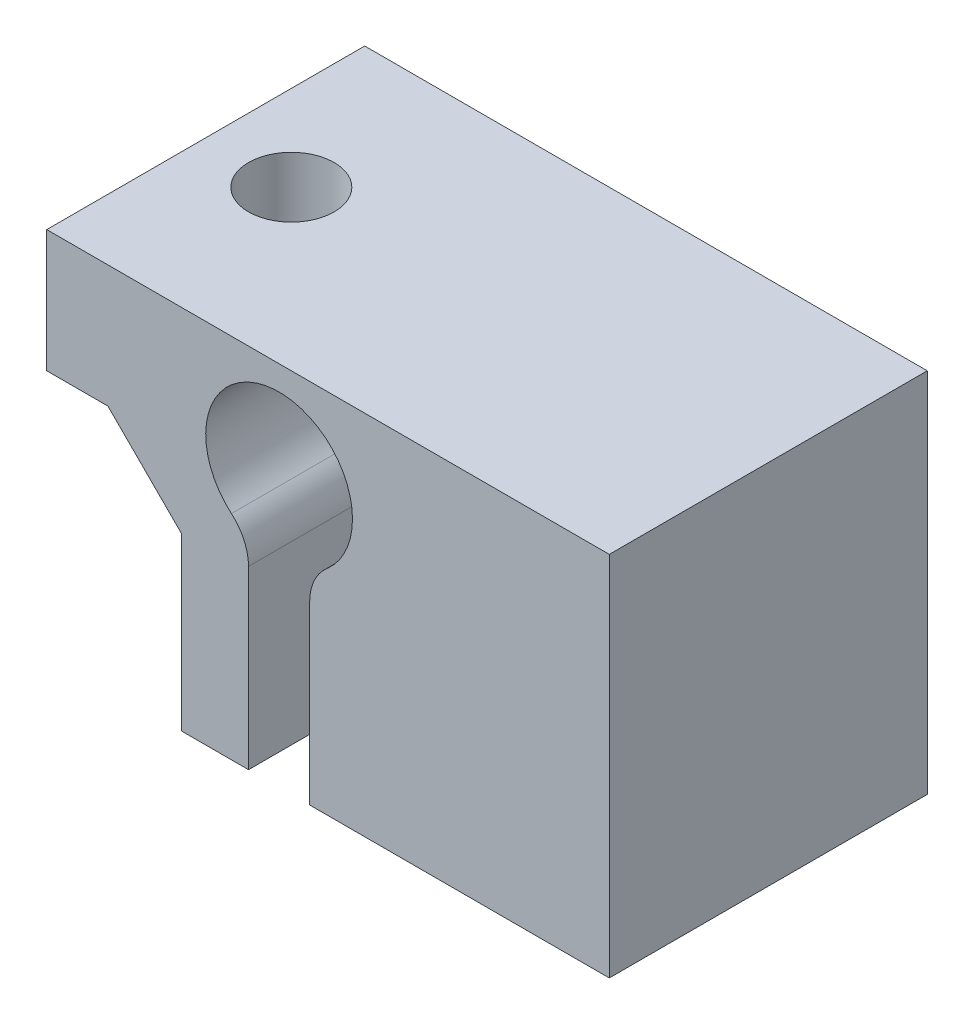
ISO-10303-21;
HEADER;
FILE_DESCRIPTION(('STEP AP214'),'2;1');
FILE_NAME('part.step','',(''),(''),'','','');
FILE_SCHEMA(('AUTOMOTIVE_DESIGN { 1 0 10303 214 1 1 1 1 }'));
ENDSEC;
DATA;
#1=APPLICATION_CONTEXT('core data for automotive mechanical design processes');
#2=APPLICATION_PROTOCOL_DEFINITION('international standard','automotive_design',2000,#1);
#3=PRODUCT_CONTEXT('',#1,'mechanical');
#4=PRODUCT('Part','Part','',(#3));
#5=PRODUCT_RELATED_PRODUCT_CATEGORY('part','',(#4));
#6=PRODUCT_DEFINITION_FORMATION('','',#4);
#7=PRODUCT_DEFINITION_CONTEXT('part definition',#1,'design');
#8=PRODUCT_DEFINITION('design','',#6,#7);
#9=PRODUCT_DEFINITION_SHAPE('','',#8);
#10=(LENGTH_UNIT() NAMED_UNIT(*) SI_UNIT(.MILLI.,.METRE.));
#11=(NAMED_UNIT(*) PLANE_ANGLE_UNIT() SI_UNIT($,.RADIAN.));
#12=(NAMED_UNIT(*) SI_UNIT($,.STERADIAN.) SOLID_ANGLE_UNIT());
#13=UNCERTAINTY_MEASURE_WITH_UNIT(LENGTH_MEASURE(1.E-05),#10,'distance_accuracy_value','');
#14=(GEOMETRIC_REPRESENTATION_CONTEXT(3) GLOBAL_UNCERTAINTY_ASSIGNED_CONTEXT((#13)) GLOBAL_UNIT_ASSIGNED_CONTEXT((#10,
#11,#12)) REPRESENTATION_CONTEXT('',''));
#15=CARTESIAN_POINT('',(0.,0.,0.));
#16=DIRECTION('',(0.,0.,1.));
#17=DIRECTION('',(1.,0.,0.));
#18=AXIS2_PLACEMENT_3D('',#15,#16,#17);
#19=CARTESIAN_POINT('',(0.,11.,-6.5));
#20=DIRECTION('',(0.,0.,1.));
#21=DIRECTION('',(1.,0.,0.));
#22=AXIS2_PLACEMENT_3D('',#19,#20,#21);
#23=CYLINDRICAL_SURFACE('',#22,1.75);
#24=CARTESIAN_POINT('',(0.,11.,-2.5));
#25=DIRECTION('',(0.,0.,1.));
#26=DIRECTION('',(1.,0.,0.));
#27=AXIS2_PLACEMENT_3D('',#24,#25,#26);
#28=CIRCLE('',#27,1.75);
#29=CARTESIAN_POINT('',(1.75,11.,-2.5));
#30=VERTEX_POINT('',#29);
#31=EDGE_CURVE('E258',#30,#30,#28,.T.);
#32=ORIENTED_EDGE('',*,*,#31,.T.);
#33=EDGE_LOOP('',(#32));
#34=FACE_BOUND('',#33,.T.);
#35=CARTESIAN_POINT('',(0.,11.,-4.));
#36=DIRECTION('',(0.,0.,-1.));
#37=DIRECTION('',(-1.,0.,0.));
#38=AXIS2_PLACEMENT_3D('',#35,#36,#37);
#39=CIRCLE('',#38,1.75);
#40=CARTESIAN_POINT('',(-1.75,11.,-4.));
#41=VERTEX_POINT('',#40);
#42=EDGE_CURVE('E226',#41,#41,#39,.T.);
#43=ORIENTED_EDGE('',*,*,#42,.T.);
#44=EDGE_LOOP('',(#43));
#45=FACE_BOUND('',#44,.T.);
#46=ADVANCED_FACE('F39',(#34,#45),#23,.F.);
#47=CARTESIAN_POINT('',(-13.5,16.,6.5));
#48=DIRECTION('',(0.,0.,-1.));
#49=DIRECTION('',(-1.,0.,0.));
#50=AXIS2_PLACEMENT_3D('',#47,#48,#49);
#51=PLANE('',#50);
#52=DIRECTION('',(0.,-1.,0.));
#53=VECTOR('',#52,1.);
#54=CARTESIAN_POINT('',(-1.25,0.,6.5));
#55=LINE('',#54,#53);
#56=CARTESIAN_POINT('',(-1.25,7.20032896160733,6.5));
#57=VERTEX_POINT('',#56);
#58=CARTESIAN_POINT('',(-1.25,0.,6.5));
#59=VERTEX_POINT('',#58);
#60=EDGE_CURVE('E322',#57,#59,#55,.T.);
#61=ORIENTED_EDGE('',*,*,#60,.F.);
#62=CARTESIAN_POINT('',(-3.25,7.20032896160733,6.5));
#63=DIRECTION('',(0.,0.,-1.));
#64=DIRECTION('',(-1.,0.,0.));
#65=AXIS2_PLACEMENT_3D('',#62,#63,#64);
#66=CIRCLE('',#65,2.);
#67=CARTESIAN_POINT('',(-1.95,8.7201973769644,6.5));
#68=VERTEX_POINT('',#67);
#69=EDGE_CURVE('E420',#57,#68,#66,.F.);
#70=ORIENTED_EDGE('',*,*,#69,.T.);
#71=CARTESIAN_POINT('',(0.,11.,6.5));
#72=DIRECTION('',(0.,0.,1.));
#73=DIRECTION('',(1.,0.,0.));
#74=AXIS2_PLACEMENT_3D('',#71,#72,#73);
#75=CIRCLE('',#74,3.);
#76=CARTESIAN_POINT('',(1.95,8.7201973769644,6.5));
#77=VERTEX_POINT('',#76);
#78=EDGE_CURVE('E304',#77,#68,#75,.T.);
#79=ORIENTED_EDGE('',*,*,#78,.F.);
#80=CARTESIAN_POINT('',(3.25,7.20032896160733,6.5));
#81=DIRECTION('',(0.,0.,-1.));
#82=DIRECTION('',(-1.,0.,0.));
#83=AXIS2_PLACEMENT_3D('',#80,#81,#82);
#84=CIRCLE('',#83,2.);
#85=CARTESIAN_POINT('',(1.25,7.20032896160733,6.5));
#86=VERTEX_POINT('',#85);
#87=EDGE_CURVE('E417',#77,#86,#84,.F.);
#88=ORIENTED_EDGE('',*,*,#87,.T.);
#89=DIRECTION('',(0.,-1.,0.));
#90=VECTOR('',#89,1.);
#91=CARTESIAN_POINT('',(1.25,0.,6.5));
#92=LINE('',#91,#90);
#93=CARTESIAN_POINT('',(1.25,0.,6.5));
#94=VERTEX_POINT('',#93);
#95=EDGE_CURVE('E309',#86,#94,#92,.T.);
#96=ORIENTED_EDGE('',*,*,#95,.T.);
#97=DIRECTION('',(1.,0.,0.));
#98=VECTOR('',#97,1.);
#99=CARTESIAN_POINT('',(-13.5,0.,6.5));
#100=LINE('',#99,#98);
#101=CARTESIAN_POINT('',(13.5,0.,6.5));
#102=VERTEX_POINT('',#101);
#103=EDGE_CURVE('E361',#94,#102,#100,.T.);
#104=ORIENTED_EDGE('',*,*,#103,.T.);
#105=DIRECTION('',(0.,-1.,0.));
#106=VECTOR('',#105,1.);
#107=CARTESIAN_POINT('',(13.5,16.,6.5));
#108=LINE('',#107,#106);
#109=CARTESIAN_POINT('',(13.5,15.,6.5));
#110=VERTEX_POINT('',#109);
#111=EDGE_CURVE('E366',#110,#102,#108,.T.);
#112=ORIENTED_EDGE('',*,*,#111,.F.);
#113=DIRECTION('',(1.,0.,0.));
#114=VECTOR('',#113,1.);
#115=CARTESIAN_POINT('',(-9.49999999999999,15.,6.5));
#116=LINE('',#115,#114);
#117=CARTESIAN_POINT('',(-9.49999999999999,15.,6.5));
#118=VERTEX_POINT('',#117);
#119=EDGE_CURVE('E276',#118,#110,#116,.T.);
#120=ORIENTED_EDGE('',*,*,#119,.F.);
#121=DIRECTION('',(0.,1.,0.));
#122=VECTOR('',#121,1.);
#123=CARTESIAN_POINT('',(-9.49999999999999,10.,6.5));
#124=LINE('',#123,#122);
#125=CARTESIAN_POINT('',(-9.49999999999999,10.,6.5));
#126=VERTEX_POINT('',#125);
#127=EDGE_CURVE('E300',#126,#118,#124,.T.);
#128=ORIENTED_EDGE('',*,*,#127,.F.);
#129=DIRECTION('',(1.,0.,0.));
#130=VECTOR('',#129,1.);
#131=CARTESIAN_POINT('',(-13.5,10.,6.5));
#132=LINE('',#131,#130);
#133=CARTESIAN_POINT('',(-6.99999999999998,10.,6.5));
#134=VERTEX_POINT('',#133);
#135=EDGE_CURVE('E335',#126,#134,#132,.T.);
#136=ORIENTED_EDGE('',*,*,#135,.T.);
#137=DIRECTION('',(0.707106781186544,-0.707106781186551,0.));
#138=VECTOR('',#137,1.);
#139=CARTESIAN_POINT('',(-13.25,16.25,6.5));
#140=LINE('',#139,#138);
#141=CARTESIAN_POINT('',(-3.99999999999999,6.99999999999998,6.5));
#142=VERTEX_POINT('',#141);
#143=EDGE_CURVE('E410',#134,#142,#140,.T.);
#144=ORIENTED_EDGE('',*,*,#143,.T.);
#145=DIRECTION('',(0.,-1.,0.));
#146=VECTOR('',#145,1.);
#147=CARTESIAN_POINT('',(-3.99999999999999,10.,6.5));
#148=LINE('',#147,#146);
#149=CARTESIAN_POINT('',(-3.99999999999999,0.,6.5));
#150=VERTEX_POINT('',#149);
#151=EDGE_CURVE('E350',#142,#150,#148,.T.);
#152=ORIENTED_EDGE('',*,*,#151,.T.);
#153=EDGE_CURVE('E362',#150,#59,#100,.T.);
#154=ORIENTED_EDGE('',*,*,#153,.T.);
#155=EDGE_LOOP('',(#61,#70,#79,#88,#96,#104,#112,#120,#128,#136,#144,#152,#154));
#156=FACE_BOUND('',#155,.T.);
#157=ADVANCED_FACE('F445',(#156),#51,.F.);
#158=CARTESIAN_POINT('',(-13.5,16.,-6.5));
#159=DIRECTION('',(0.,0.,1.));
#160=DIRECTION('',(1.,0.,0.));
#161=AXIS2_PLACEMENT_3D('',#158,#159,#160);
#162=PLANE('',#161);
#163=DIRECTION('',(0.866025403784438,-0.5,0.));
#164=VECTOR('',#163,1.);
#165=CARTESIAN_POINT('',(0.,14.1754264805429,-6.5));
#166=LINE('',#165,#164);
#167=CARTESIAN_POINT('',(0.,14.1754264805429,-6.5));
#168=VERTEX_POINT('',#167);
#169=CARTESIAN_POINT('',(2.75,12.5877132402715,-6.5));
#170=VERTEX_POINT('',#169);
#171=EDGE_CURVE('E241',#168,#170,#166,.T.);
#172=ORIENTED_EDGE('',*,*,#171,.F.);
#173=DIRECTION('',(0.866025403784439,0.5,0.));
#174=VECTOR('',#173,1.);
#175=CARTESIAN_POINT('',(-2.75,12.5877132402715,-6.5));
#176=LINE('',#175,#174);
#177=CARTESIAN_POINT('',(-2.75,12.5877132402715,-6.5));
#178=VERTEX_POINT('',#177);
#179=EDGE_CURVE('E198',#178,#168,#176,.T.);
#180=ORIENTED_EDGE('',*,*,#179,.F.);
#181=DIRECTION('',(0.,1.,0.));
#182=VECTOR('',#181,1.);
#183=CARTESIAN_POINT('',(-2.75,9.41228675972853,-6.5));
#184=LINE('',#183,#182);
#185=CARTESIAN_POINT('',(-2.75,9.41228675972853,-6.5));
#186=VERTEX_POINT('',#185);
#187=EDGE_CURVE('E219',#186,#178,#184,.T.);
#188=ORIENTED_EDGE('',*,*,#187,.F.);
#189=DIRECTION('',(-0.866025403784439,0.5,0.));
#190=VECTOR('',#189,1.);
#191=CARTESIAN_POINT('',(0.,7.82457351945706,-6.5));
#192=LINE('',#191,#190);
#193=CARTESIAN_POINT('',(0.,7.82457351945706,-6.5));
#194=VERTEX_POINT('',#193);
#195=EDGE_CURVE('E223',#194,#186,#192,.T.);
#196=ORIENTED_EDGE('',*,*,#195,.F.);
#197=DIRECTION('',(-0.866025403784439,-0.5,0.));
#198=VECTOR('',#197,1.);
#199=CARTESIAN_POINT('',(2.75,9.41228675972853,-6.5));
#200=LINE('',#199,#198);
#201=CARTESIAN_POINT('',(2.75,9.41228675972853,-6.5));
#202=VERTEX_POINT('',#201);
#203=EDGE_CURVE('E248',#202,#194,#200,.T.);
#204=ORIENTED_EDGE('',*,*,#203,.F.);
#205=DIRECTION('',(0.,-1.,0.));
#206=VECTOR('',#205,1.);
#207=CARTESIAN_POINT('',(2.75,12.5877132402715,-6.5));
#208=LINE('',#207,#206);
#209=EDGE_CURVE('E244',#170,#202,#208,.T.);
#210=ORIENTED_EDGE('',*,*,#209,.F.);
#211=EDGE_LOOP('',(#172,#180,#188,#196,#204,#210));
#212=FACE_BOUND('',#211,.T.);
#213=DIRECTION('',(-1.,0.,0.));
#214=VECTOR('',#213,1.);
#215=CARTESIAN_POINT('',(13.5,15.,-6.5));
#216=LINE('',#215,#214);
#217=CARTESIAN_POINT('',(13.5,15.,-6.5));
#218=VERTEX_POINT('',#217);
#219=CARTESIAN_POINT('',(-9.49999999999999,15.,-6.5));
#220=VERTEX_POINT('',#219);
#221=EDGE_CURVE('E270',#218,#220,#216,.T.);
#222=ORIENTED_EDGE('',*,*,#221,.F.);
#223=DIRECTION('',(0.,-1.,0.));
#224=VECTOR('',#223,1.);
#225=CARTESIAN_POINT('',(13.5,16.,-6.5));
#226=LINE('',#225,#224);
#227=CARTESIAN_POINT('',(13.5,0.,-6.5));
#228=VERTEX_POINT('',#227);
#229=EDGE_CURVE('E369',#218,#228,#226,.T.);
#230=ORIENTED_EDGE('',*,*,#229,.T.);
#231=DIRECTION('',(-1.,0.,0.));
#232=VECTOR('',#231,1.);
#233=CARTESIAN_POINT('',(-13.5,0.,-6.5));
#234=LINE('',#233,#232);
#235=CARTESIAN_POINT('',(-3.99999999999999,0.,-6.5));
#236=VERTEX_POINT('',#235);
#237=EDGE_CURVE('E357',#228,#236,#234,.T.);
#238=ORIENTED_EDGE('',*,*,#237,.T.);
#239=DIRECTION('',(0.,-1.,0.));
#240=VECTOR('',#239,1.);
#241=CARTESIAN_POINT('',(-3.99999999999999,10.,-6.5));
#242=LINE('',#241,#240);
#243=CARTESIAN_POINT('',(-3.99999999999999,6.99999999999998,-6.5));
#244=VERTEX_POINT('',#243);
#245=EDGE_CURVE('E343',#244,#236,#242,.T.);
#246=ORIENTED_EDGE('',*,*,#245,.F.);
#247=DIRECTION('',(-0.707106781186544,0.707106781186551,0.));
#248=VECTOR('',#247,1.);
#249=CARTESIAN_POINT('',(-13.25,16.25,-6.5));
#250=LINE('',#249,#248);
#251=CARTESIAN_POINT('',(-6.99999999999998,10.,-6.5));
#252=VERTEX_POINT('',#251);
#253=EDGE_CURVE('E400',#244,#252,#250,.T.);
#254=ORIENTED_EDGE('',*,*,#253,.T.);
#255=DIRECTION('',(-1.,0.,0.));
#256=VECTOR('',#255,1.);
#257=CARTESIAN_POINT('',(-13.5,10.,-6.5));
#258=LINE('',#257,#256);
#259=CARTESIAN_POINT('',(-9.49999999999999,10.,-6.5));
#260=VERTEX_POINT('',#259);
#261=EDGE_CURVE('E339',#252,#260,#258,.T.);
#262=ORIENTED_EDGE('',*,*,#261,.T.);
#263=DIRECTION('',(0.,-1.,0.));
#264=VECTOR('',#263,1.);
#265=CARTESIAN_POINT('',(-9.49999999999999,16.,-6.5));
#266=LINE('',#265,#264);
#267=EDGE_CURVE('E291',#220,#260,#266,.T.);
#268=ORIENTED_EDGE('',*,*,#267,.F.);
#269=EDGE_LOOP('',(#222,#230,#238,#246,#254,#262,#268));
#270=FACE_BOUND('',#269,.T.);
#271=ADVANCED_FACE('F468',(#212,#270),#162,.F.);
#272=CARTESIAN_POINT('',(13.5,16.,6.5));
#273=DIRECTION('',(-1.,0.,0.));
#274=DIRECTION('',(0.,0.,1.));
#275=AXIS2_PLACEMENT_3D('',#272,#273,#274);
#276=PLANE('',#275);
#277=DIRECTION('',(0.,0.,-1.));
#278=VECTOR('',#277,1.);
#279=CARTESIAN_POINT('',(13.5,15.,6.5));
#280=LINE('',#279,#278);
#281=EDGE_CURVE('E279',#110,#218,#280,.T.);
#282=ORIENTED_EDGE('',*,*,#281,.F.);
#283=ORIENTED_EDGE('',*,*,#111,.T.);
#284=DIRECTION('',(0.,0.,-1.));
#285=VECTOR('',#284,1.);
#286=CARTESIAN_POINT('',(13.5,0.,6.5));
#287=LINE('',#286,#285);
#288=EDGE_CURVE('E353',#102,#228,#287,.T.);
#289=ORIENTED_EDGE('',*,*,#288,.T.);
#290=ORIENTED_EDGE('',*,*,#229,.F.);
#291=EDGE_LOOP('',(#282,#283,#289,#290));
#292=FACE_BOUND('',#291,.T.);
#293=ADVANCED_FACE('F473',(#292),#276,.F.);
#294=CARTESIAN_POINT('',(-5.99999999999999,16.,0.));
#295=DIRECTION('',(0.,-1.,0.));
#296=DIRECTION('',(0.,0.,-1.));
#297=AXIS2_PLACEMENT_3D('',#294,#295,#296);
#298=CYLINDRICAL_SURFACE('',#297,1.75);
#299=CARTESIAN_POINT('',(-5.99999999999999,10.,0.));
#300=DIRECTION('',(0.,1.,0.));
#301=DIRECTION('',(0.,0.,1.));
#302=AXIS2_PLACEMENT_3D('',#299,#300,#301);
#303=CIRCLE('',#302,1.75);
#304=CARTESIAN_POINT('',(-5.99999999999999,10.,1.75));
#305=VERTEX_POINT('',#304);
#306=EDGE_CURVE('E331',#305,#305,#303,.F.);
#307=ORIENTED_EDGE('',*,*,#306,.T.);
#308=EDGE_LOOP('',(#307));
#309=FACE_BOUND('',#308,.T.);
#310=CARTESIAN_POINT('',(-5.99999999999999,15.,0.));
#311=DIRECTION('',(0.,1.,0.));
#312=DIRECTION('',(0.,0.,1.));
#313=AXIS2_PLACEMENT_3D('',#310,#311,#312);
#314=CIRCLE('',#313,1.75);
#315=CARTESIAN_POINT('',(-5.99999999999999,15.,1.75));
#316=VERTEX_POINT('',#315);
#317=EDGE_CURVE('E282',#316,#316,#314,.T.);
#318=ORIENTED_EDGE('',*,*,#317,.T.);
#319=EDGE_LOOP('',(#318));
#320=FACE_BOUND('',#319,.T.);
#321=ADVANCED_FACE('F533',(#309,#320),#298,.F.);
#322=CARTESIAN_POINT('',(-9.49999999999999,0.,0.));
#323=DIRECTION('',(-1.,0.,0.));
#324=DIRECTION('',(0.,0.,1.));
#325=AXIS2_PLACEMENT_3D('',#322,#323,#324);
#326=PLANE('',#325);
#327=ORIENTED_EDGE('',*,*,#127,.T.);
#328=DIRECTION('',(0.,0.,1.));
#329=VECTOR('',#328,1.);
#330=CARTESIAN_POINT('',(-9.49999999999999,15.,-6.5));
#331=LINE('',#330,#329);
#332=EDGE_CURVE('E273',#220,#118,#331,.T.);
#333=ORIENTED_EDGE('',*,*,#332,.F.);
#334=ORIENTED_EDGE('',*,*,#267,.T.);
#335=DIRECTION('',(0.,0.,1.));
#336=VECTOR('',#335,1.);
#337=CARTESIAN_POINT('',(-9.49999999999999,10.,-6.5));
#338=LINE('',#337,#336);
#339=EDGE_CURVE('E297',#260,#126,#338,.T.);
#340=ORIENTED_EDGE('',*,*,#339,.T.);
#341=EDGE_LOOP('',(#327,#333,#334,#340));
#342=FACE_BOUND('',#341,.T.);
#343=ADVANCED_FACE('F480',(#342),#326,.T.);
#344=CARTESIAN_POINT('',(-3.99999999999999,10.,-6.5));
#345=DIRECTION('',(-1.,0.,0.));
#346=DIRECTION('',(0.,0.,1.));
#347=AXIS2_PLACEMENT_3D('',#344,#345,#346);
#348=PLANE('',#347);
#349=ORIENTED_EDGE('',*,*,#151,.F.);
#350=DIRECTION('',(0.,0.,-1.));
#351=VECTOR('',#350,1.);
#352=CARTESIAN_POINT('',(-3.99999999999999,6.99999999999998,-6.5));
#353=LINE('',#352,#351);
#354=CARTESIAN_POINT('',(-3.99999999999999,6.99999999999998,2.23606797749979));
#355=VERTEX_POINT('',#354);
#356=EDGE_CURVE('E396',#142,#355,#353,.T.);
#357=ORIENTED_EDGE('',*,*,#356,.T.);
#358=DIRECTION('',(0.,1.,0.));
#359=VECTOR('',#358,1.);
#360=CARTESIAN_POINT('',(-3.99999999999999,0.,2.23606797749979));
#361=LINE('',#360,#359);
#362=CARTESIAN_POINT('',(-3.99999999999999,0.,2.23606797749979));
#363=VERTEX_POINT('',#362);
#364=EDGE_CURVE('E379',#355,#363,#361,.F.);
#365=ORIENTED_EDGE('',*,*,#364,.T.);
#366=DIRECTION('',(0.,0.,-1.));
#367=VECTOR('',#366,1.);
#368=CARTESIAN_POINT('',(-3.99999999999999,0.,-6.5));
#369=LINE('',#368,#367);
#370=EDGE_CURVE('E340',#150,#363,#369,.T.);
#371=ORIENTED_EDGE('',*,*,#370,.F.);
#372=EDGE_LOOP('',(#349,#357,#365,#371));
#373=FACE_BOUND('',#372,.T.);
#374=ADVANCED_FACE('F494',(#373),#348,.T.);
#375=DIRECTION('',(0.,1.,0.));
#376=VECTOR('',#375,1.);
#377=CARTESIAN_POINT('',(-3.99999999999999,0.,-2.23606797749979));
#378=LINE('',#377,#376);
#379=CARTESIAN_POINT('',(-3.99999999999999,0.,-2.23606797749979));
#380=VERTEX_POINT('',#379);
#381=CARTESIAN_POINT('',(-3.99999999999999,6.99999999999998,-2.23606797749979));
#382=VERTEX_POINT('',#381);
#383=EDGE_CURVE('E372',#380,#382,#378,.T.);
#384=ORIENTED_EDGE('',*,*,#383,.T.);
#385=DIRECTION('',(0.,0.,-1.));
#386=VECTOR('',#385,1.);
#387=CARTESIAN_POINT('',(-3.99999999999999,6.99999999999998,-6.5));
#388=LINE('',#387,#386);
#389=EDGE_CURVE('E382',#382,#244,#388,.T.);
#390=ORIENTED_EDGE('',*,*,#389,.T.);
#391=ORIENTED_EDGE('',*,*,#245,.T.);
#392=EDGE_CURVE('E347',#380,#236,#369,.T.);
#393=ORIENTED_EDGE('',*,*,#392,.F.);
#394=EDGE_LOOP('',(#384,#390,#391,#393));
#395=FACE_BOUND('',#394,.T.);
#396=ADVANCED_FACE('F501',(#395),#348,.T.);
#397=CARTESIAN_POINT('',(0.,10.,0.));
#398=DIRECTION('',(0.,1.,0.));
#399=DIRECTION('',(0.,0.,1.));
#400=AXIS2_PLACEMENT_3D('',#397,#398,#399);
#401=PLANE('',#400);
#402=ORIENTED_EDGE('',*,*,#306,.F.);
#403=EDGE_LOOP('',(#402));
#404=FACE_BOUND('',#403,.T.);
#405=ORIENTED_EDGE('',*,*,#261,.F.);
#406=DIRECTION('',(0.,0.,1.));
#407=VECTOR('',#406,1.);
#408=CARTESIAN_POINT('',(-6.99999999999998,10.,0.));
#409=LINE('',#408,#407);
#410=CARTESIAN_POINT('',(-6.99999999999998,10.,-2.82842712474619));
#411=VERTEX_POINT('',#410);
#412=EDGE_CURVE('E392',#252,#411,#409,.T.);
#413=ORIENTED_EDGE('',*,*,#412,.T.);
#414=CARTESIAN_POINT('',(-5.99999999999999,10.,0.));
#415=DIRECTION('',(0.,-1.,0.));
#416=DIRECTION('',(0.,0.,-1.));
#417=AXIS2_PLACEMENT_3D('',#414,#415,#416);
#418=CIRCLE('',#417,3.);
#419=CARTESIAN_POINT('',(-6.99999999999998,10.,2.8284271247462));
#420=VERTEX_POINT('',#419);
#421=EDGE_CURVE('E286',#411,#420,#418,.T.);
#422=ORIENTED_EDGE('',*,*,#421,.T.);
#423=DIRECTION('',(0.,0.,1.));
#424=VECTOR('',#423,1.);
#425=CARTESIAN_POINT('',(-6.99999999999998,10.,0.));
#426=LINE('',#425,#424);
#427=EDGE_CURVE('E389',#420,#134,#426,.T.);
#428=ORIENTED_EDGE('',*,*,#427,.T.);
#429=ORIENTED_EDGE('',*,*,#135,.F.);
#430=ORIENTED_EDGE('',*,*,#339,.F.);
#431=EDGE_LOOP('',(#405,#413,#422,#428,#429,#430));
#432=FACE_BOUND('',#431,.T.);
#433=ADVANCED_FACE('F484',(#404,#432),#401,.F.);
#434=CARTESIAN_POINT('',(0.,0.,0.));
#435=DIRECTION('',(0.,-1.,0.));
#436=DIRECTION('',(0.,0.,-1.));
#437=AXIS2_PLACEMENT_3D('',#434,#435,#436);
#438=PLANE('',#437);
#439=ORIENTED_EDGE('',*,*,#370,.T.);
#440=CARTESIAN_POINT('',(-5.99999999999999,0.,0.));
#441=DIRECTION('',(0.,-1.,0.));
#442=DIRECTION('',(0.,0.,-1.));
#443=AXIS2_PLACEMENT_3D('',#440,#441,#442);
#444=CIRCLE('',#443,3.);
#445=EDGE_CURVE('E287',#380,#363,#444,.T.);
#446=ORIENTED_EDGE('',*,*,#445,.F.);
#447=ORIENTED_EDGE('',*,*,#392,.T.);
#448=ORIENTED_EDGE('',*,*,#237,.F.);
#449=ORIENTED_EDGE('',*,*,#288,.F.);
#450=ORIENTED_EDGE('',*,*,#103,.F.);
#451=DIRECTION('',(0.,0.,1.));
#452=VECTOR('',#451,1.);
#453=CARTESIAN_POINT('',(1.25,0.,-2.5));
#454=LINE('',#453,#452);
#455=CARTESIAN_POINT('',(1.25,0.,-2.5));
#456=VERTEX_POINT('',#455);
#457=EDGE_CURVE('E327',#456,#94,#454,.T.);
#458=ORIENTED_EDGE('',*,*,#457,.F.);
#459=DIRECTION('',(1.,0.,0.));
#460=VECTOR('',#459,1.);
#461=CARTESIAN_POINT('',(0.,0.,-2.5));
#462=LINE('',#461,#460);
#463=CARTESIAN_POINT('',(-1.25,0.,-2.5));
#464=VERTEX_POINT('',#463);
#465=EDGE_CURVE('E312',#464,#456,#462,.T.);
#466=ORIENTED_EDGE('',*,*,#465,.F.);
#467=DIRECTION('',(0.,0.,1.));
#468=VECTOR('',#467,1.);
#469=CARTESIAN_POINT('',(-1.25,0.,-2.5));
#470=LINE('',#469,#468);
#471=EDGE_CURVE('E319',#464,#59,#470,.T.);
#472=ORIENTED_EDGE('',*,*,#471,.T.);
#473=ORIENTED_EDGE('',*,*,#153,.F.);
#474=EDGE_LOOP('',(#439,#446,#447,#448,#449,#450,#458,#466,#472,#473));
#475=FACE_BOUND('',#474,.T.);
#476=ADVANCED_FACE('F456',(#475),#438,.T.);
#477=CARTESIAN_POINT('',(0.,11.,-2.5));
#478=DIRECTION('',(0.,0.,1.));
#479=DIRECTION('',(1.,0.,0.));
#480=AXIS2_PLACEMENT_3D('',#477,#478,#479);
#481=CYLINDRICAL_SURFACE('',#480,3.);
#482=ORIENTED_EDGE('',*,*,#78,.T.);
#483=DIRECTION('',(0.,0.,1.));
#484=VECTOR('',#483,1.);
#485=CARTESIAN_POINT('',(-1.95,8.7201973769644,-2.5));
#486=LINE('',#485,#484);
#487=CARTESIAN_POINT('',(-1.95,8.7201973769644,-2.5));
#488=VERTEX_POINT('',#487);
#489=EDGE_CURVE('E63',#68,#488,#486,.F.);
#490=ORIENTED_EDGE('',*,*,#489,.T.);
#491=CARTESIAN_POINT('',(0.,11.,-2.5));
#492=DIRECTION('',(0.,0.,1.));
#493=DIRECTION('',(1.,0.,0.));
#494=AXIS2_PLACEMENT_3D('',#491,#492,#493);
#495=CIRCLE('',#494,3.);
#496=CARTESIAN_POINT('',(1.95,8.7201973769644,-2.5));
#497=VERTEX_POINT('',#496);
#498=EDGE_CURVE('E305',#497,#488,#495,.T.);
#499=ORIENTED_EDGE('',*,*,#498,.F.);
#500=DIRECTION('',(0.,0.,1.));
#501=VECTOR('',#500,1.);
#502=CARTESIAN_POINT('',(1.95,8.7201973769644,-2.5));
#503=LINE('',#502,#501);
#504=EDGE_CURVE('E423',#497,#77,#503,.T.);
#505=ORIENTED_EDGE('',*,*,#504,.T.);
#506=EDGE_LOOP('',(#482,#490,#499,#505));
#507=FACE_BOUND('',#506,.T.);
#508=ADVANCED_FACE('F446',(#507),#481,.F.);
#509=CARTESIAN_POINT('',(1.25,0.,-2.5));
#510=DIRECTION('',(-1.,0.,0.));
#511=DIRECTION('',(0.,-1.,0.));
#512=AXIS2_PLACEMENT_3D('',#509,#510,#511);
#513=PLANE('',#512);
#514=ORIENTED_EDGE('',*,*,#95,.F.);
#515=DIRECTION('',(0.,0.,-1.));
#516=VECTOR('',#515,1.);
#517=CARTESIAN_POINT('',(1.25,7.20032896160733,-2.5));
#518=LINE('',#517,#516);
#519=CARTESIAN_POINT('',(1.25,7.20032896160733,-2.5));
#520=VERTEX_POINT('',#519);
#521=EDGE_CURVE('E55',#86,#520,#518,.T.);
#522=ORIENTED_EDGE('',*,*,#521,.T.);
#523=DIRECTION('',(0.,-1.,0.));
#524=VECTOR('',#523,1.);
#525=CARTESIAN_POINT('',(1.25,0.,-2.5));
#526=LINE('',#525,#524);
#527=EDGE_CURVE('E316',#520,#456,#526,.T.);
#528=ORIENTED_EDGE('',*,*,#527,.T.);
#529=ORIENTED_EDGE('',*,*,#457,.T.);
#530=EDGE_LOOP('',(#514,#522,#528,#529));
#531=FACE_BOUND('',#530,.T.);
#532=ADVANCED_FACE('F451',(#531),#513,.T.);
#533=CARTESIAN_POINT('',(-1.25,0.,-2.5));
#534=DIRECTION('',(-1.,0.,0.));
#535=DIRECTION('',(0.,-1.,0.));
#536=AXIS2_PLACEMENT_3D('',#533,#534,#535);
#537=PLANE('',#536);
#538=DIRECTION('',(0.,-1.,0.));
#539=VECTOR('',#538,1.);
#540=CARTESIAN_POINT('',(-1.25,0.,-2.5));
#541=LINE('',#540,#539);
#542=CARTESIAN_POINT('',(-1.25,7.20032896160733,-2.5));
#543=VERTEX_POINT('',#542);
#544=EDGE_CURVE('E308',#543,#464,#541,.T.);
#545=ORIENTED_EDGE('',*,*,#544,.F.);
#546=DIRECTION('',(0.,0.,1.));
#547=VECTOR('',#546,1.);
#548=CARTESIAN_POINT('',(-1.25,7.20032896160733,-2.5));
#549=LINE('',#548,#547);
#550=EDGE_CURVE('E413',#543,#57,#549,.T.);
#551=ORIENTED_EDGE('',*,*,#550,.T.);
#552=ORIENTED_EDGE('',*,*,#60,.T.);
#553=ORIENTED_EDGE('',*,*,#471,.F.);
#554=EDGE_LOOP('',(#545,#551,#552,#553));
#555=FACE_BOUND('',#554,.T.);
#556=ADVANCED_FACE('F439',(#555),#537,.F.);
#557=CARTESIAN_POINT('',(0.,0.,-2.5));
#558=DIRECTION('',(0.,0.,1.));
#559=DIRECTION('',(1.,0.,0.));
#560=AXIS2_PLACEMENT_3D('',#557,#558,#559);
#561=PLANE('',#560);
#562=ORIENTED_EDGE('',*,*,#31,.F.);
#563=EDGE_LOOP('',(#562));
#564=FACE_BOUND('',#563,.T.);
#565=ORIENTED_EDGE('',*,*,#527,.F.);
#566=CARTESIAN_POINT('',(3.25,7.20032896160733,-2.5));
#567=DIRECTION('',(0.,0.,1.));
#568=DIRECTION('',(1.,0.,0.));
#569=AXIS2_PLACEMENT_3D('',#566,#567,#568);
#570=CIRCLE('',#569,2.);
#571=EDGE_CURVE('E11',#520,#497,#570,.F.);
#572=ORIENTED_EDGE('',*,*,#571,.T.);
#573=ORIENTED_EDGE('',*,*,#498,.T.);
#574=CARTESIAN_POINT('',(-3.25,7.20032896160733,-2.5));
#575=DIRECTION('',(0.,0.,1.));
#576=DIRECTION('',(1.,0.,0.));
#577=AXIS2_PLACEMENT_3D('',#574,#575,#576);
#578=CIRCLE('',#577,2.);
#579=EDGE_CURVE('E48',#488,#543,#578,.F.);
#580=ORIENTED_EDGE('',*,*,#579,.T.);
#581=ORIENTED_EDGE('',*,*,#544,.T.);
#582=ORIENTED_EDGE('',*,*,#465,.T.);
#583=EDGE_LOOP('',(#565,#572,#573,#580,#581,#582));
#584=FACE_BOUND('',#583,.T.);
#585=ADVANCED_FACE('F434',(#564,#584),#561,.T.);
#586=CARTESIAN_POINT('',(-5.99999999999999,0.,0.));
#587=DIRECTION('',(0.,1.,0.));
#588=DIRECTION('',(0.,0.,1.));
#589=AXIS2_PLACEMENT_3D('',#586,#587,#588);
#590=CYLINDRICAL_SURFACE('',#589,3.);
#591=ORIENTED_EDGE('',*,*,#421,.F.);
#592=CARTESIAN_POINT('',(-5.99999999999999,9.,0.));
#593=DIRECTION('',(0.707106781186551,0.707106781186544,0.));
#594=DIRECTION('',(-0.707106781186544,0.707106781186551,0.));
#595=AXIS2_PLACEMENT_3D('',#592,#593,#594);
#596=ELLIPSE('',#595,4.24264068711931,3.);
#597=EDGE_CURVE('E403',#411,#382,#596,.F.);
#598=ORIENTED_EDGE('',*,*,#597,.T.);
#599=ORIENTED_EDGE('',*,*,#383,.F.);
#600=ORIENTED_EDGE('',*,*,#445,.T.);
#601=ORIENTED_EDGE('',*,*,#364,.F.);
#602=CARTESIAN_POINT('',(-5.99999999999999,9.,0.));
#603=DIRECTION('',(0.707106781186551,0.707106781186544,0.));
#604=DIRECTION('',(-0.707106781186544,0.707106781186551,0.));
#605=AXIS2_PLACEMENT_3D('',#602,#603,#604);
#606=ELLIPSE('',#605,4.24264068711931,3.);
#607=EDGE_CURVE('E406',#355,#420,#606,.F.);
#608=ORIENTED_EDGE('',*,*,#607,.T.);
#609=EDGE_LOOP('',(#591,#598,#599,#600,#601,#608));
#610=FACE_BOUND('',#609,.T.);
#611=ADVANCED_FACE('F497',(#610),#590,.F.);
#612=CARTESIAN_POINT('',(0.,15.,0.));
#613=DIRECTION('',(0.,1.,0.));
#614=DIRECTION('',(0.,0.,1.));
#615=AXIS2_PLACEMENT_3D('',#612,#613,#614);
#616=PLANE('',#615);
#617=ORIENTED_EDGE('',*,*,#317,.F.);
#618=EDGE_LOOP('',(#617));
#619=FACE_BOUND('',#618,.T.);
#620=ORIENTED_EDGE('',*,*,#221,.T.);
#621=ORIENTED_EDGE('',*,*,#332,.T.);
#622=ORIENTED_EDGE('',*,*,#119,.T.);
#623=ORIENTED_EDGE('',*,*,#281,.T.);
#624=EDGE_LOOP('',(#620,#621,#622,#623));
#625=FACE_BOUND('',#624,.T.);
#626=ADVANCED_FACE('F525',(#619,#625),#616,.T.);
#627=CARTESIAN_POINT('',(-2.75,12.5877132402715,-4.));
#628=DIRECTION('',(-0.5,0.866025403784439,0.));
#629=DIRECTION('',(-0.866025403784439,-0.5,0.));
#630=AXIS2_PLACEMENT_3D('',#627,#628,#629);
#631=PLANE('',#630);
#632=ORIENTED_EDGE('',*,*,#179,.T.);
#633=DIRECTION('',(0.,0.,-1.));
#634=VECTOR('',#633,1.);
#635=CARTESIAN_POINT('',(0.,14.1754264805429,-4.));
#636=LINE('',#635,#634);
#637=CARTESIAN_POINT('',(0.,14.1754264805429,-4.));
#638=VERTEX_POINT('',#637);
#639=EDGE_CURVE('E191',#638,#168,#636,.T.);
#640=ORIENTED_EDGE('',*,*,#639,.F.);
#641=DIRECTION('',(0.866025403784439,0.5,0.));
#642=VECTOR('',#641,1.);
#643=CARTESIAN_POINT('',(-2.75,12.5877132402715,-4.));
#644=LINE('',#643,#642);
#645=CARTESIAN_POINT('',(-2.75,12.5877132402715,-4.));
#646=VERTEX_POINT('',#645);
#647=EDGE_CURVE('E195',#646,#638,#644,.T.);
#648=ORIENTED_EDGE('',*,*,#647,.F.);
#649=DIRECTION('',(0.,0.,-1.));
#650=VECTOR('',#649,1.);
#651=CARTESIAN_POINT('',(-2.75,12.5877132402715,-4.));
#652=LINE('',#651,#650);
#653=EDGE_CURVE('E255',#646,#178,#652,.T.);
#654=ORIENTED_EDGE('',*,*,#653,.T.);
#655=EDGE_LOOP('',(#632,#640,#648,#654));
#656=FACE_BOUND('',#655,.T.);
#657=ADVANCED_FACE('F193',(#656),#631,.F.);
#658=CARTESIAN_POINT('',(-2.75,9.41228675972853,-4.));
#659=DIRECTION('',(-1.,0.,0.));
#660=DIRECTION('',(0.,0.,1.));
#661=AXIS2_PLACEMENT_3D('',#658,#659,#660);
#662=PLANE('',#661);
#663=ORIENTED_EDGE('',*,*,#187,.T.);
#664=ORIENTED_EDGE('',*,*,#653,.F.);
#665=DIRECTION('',(0.,1.,0.));
#666=VECTOR('',#665,1.);
#667=CARTESIAN_POINT('',(-2.75,9.41228675972853,-4.));
#668=LINE('',#667,#666);
#669=CARTESIAN_POINT('',(-2.75,9.41228675972853,-4.));
#670=VERTEX_POINT('',#669);
#671=EDGE_CURVE('E204',#670,#646,#668,.T.);
#672=ORIENTED_EDGE('',*,*,#671,.F.);
#673=DIRECTION('',(0.,0.,-1.));
#674=VECTOR('',#673,1.);
#675=CARTESIAN_POINT('',(-2.75,9.41228675972853,-4.));
#676=LINE('',#675,#674);
#677=EDGE_CURVE('E259',#670,#186,#676,.T.);
#678=ORIENTED_EDGE('',*,*,#677,.T.);
#679=EDGE_LOOP('',(#663,#664,#672,#678));
#680=FACE_BOUND('',#679,.T.);
#681=ADVANCED_FACE('F617',(#680),#662,.F.);
#682=CARTESIAN_POINT('',(0.,7.82457351945706,-4.));
#683=DIRECTION('',(-0.5,-0.866025403784439,0.));
#684=DIRECTION('',(0.866025403784439,-0.5,0.));
#685=AXIS2_PLACEMENT_3D('',#682,#683,#684);
#686=PLANE('',#685);
#687=ORIENTED_EDGE('',*,*,#195,.T.);
#688=ORIENTED_EDGE('',*,*,#677,.F.);
#689=DIRECTION('',(-0.866025403784439,0.5,0.));
#690=VECTOR('',#689,1.);
#691=CARTESIAN_POINT('',(0.,7.82457351945706,-4.));
#692=LINE('',#691,#690);
#693=CARTESIAN_POINT('',(0.,7.82457351945706,-4.));
#694=VERTEX_POINT('',#693);
#695=EDGE_CURVE('E234',#694,#670,#692,.T.);
#696=ORIENTED_EDGE('',*,*,#695,.F.);
#697=DIRECTION('',(0.,0.,-1.));
#698=VECTOR('',#697,1.);
#699=CARTESIAN_POINT('',(0.,7.82457351945706,-4.));
#700=LINE('',#699,#698);
#701=EDGE_CURVE('E262',#694,#194,#700,.T.);
#702=ORIENTED_EDGE('',*,*,#701,.T.);
#703=EDGE_LOOP('',(#687,#688,#696,#702));
#704=FACE_BOUND('',#703,.T.);
#705=ADVANCED_FACE('F623',(#704),#686,.F.);
#706=CARTESIAN_POINT('',(2.75,9.41228675972853,-4.));
#707=DIRECTION('',(0.5,-0.866025403784439,0.));
#708=DIRECTION('',(0.866025403784439,0.5,0.));
#709=AXIS2_PLACEMENT_3D('',#706,#707,#708);
#710=PLANE('',#709);
#711=ORIENTED_EDGE('',*,*,#203,.T.);
#712=ORIENTED_EDGE('',*,*,#701,.F.);
#713=DIRECTION('',(-0.866025403784439,-0.5,0.));
#714=VECTOR('',#713,1.);
#715=CARTESIAN_POINT('',(2.75,9.41228675972853,-4.));
#716=LINE('',#715,#714);
#717=CARTESIAN_POINT('',(2.75,9.41228675972853,-4.));
#718=VERTEX_POINT('',#717);
#719=EDGE_CURVE('E230',#718,#694,#716,.T.);
#720=ORIENTED_EDGE('',*,*,#719,.F.);
#721=DIRECTION('',(0.,0.,-1.));
#722=VECTOR('',#721,1.);
#723=CARTESIAN_POINT('',(2.75,9.41228675972853,-4.));
#724=LINE('',#723,#722);
#725=EDGE_CURVE('E265',#718,#202,#724,.T.);
#726=ORIENTED_EDGE('',*,*,#725,.T.);
#727=EDGE_LOOP('',(#711,#712,#720,#726));
#728=FACE_BOUND('',#727,.T.);
#729=ADVANCED_FACE('F631',(#728),#710,.F.);
#730=CARTESIAN_POINT('',(2.75,12.5877132402715,-4.));
#731=DIRECTION('',(1.,0.,0.));
#732=DIRECTION('',(0.,0.,-1.));
#733=AXIS2_PLACEMENT_3D('',#730,#731,#732);
#734=PLANE('',#733);
#735=ORIENTED_EDGE('',*,*,#209,.T.);
#736=ORIENTED_EDGE('',*,*,#725,.F.);
#737=DIRECTION('',(0.,-1.,0.));
#738=VECTOR('',#737,1.);
#739=CARTESIAN_POINT('',(2.75,12.5877132402715,-4.));
#740=LINE('',#739,#738);
#741=CARTESIAN_POINT('',(2.75,12.5877132402715,-4.));
#742=VERTEX_POINT('',#741);
#743=EDGE_CURVE('E213',#742,#718,#740,.T.);
#744=ORIENTED_EDGE('',*,*,#743,.F.);
#745=DIRECTION('',(0.,0.,-1.));
#746=VECTOR('',#745,1.);
#747=CARTESIAN_POINT('',(2.75,12.5877132402715,-4.));
#748=LINE('',#747,#746);
#749=EDGE_CURVE('E203',#742,#170,#748,.T.);
#750=ORIENTED_EDGE('',*,*,#749,.T.);
#751=EDGE_LOOP('',(#735,#736,#744,#750));
#752=FACE_BOUND('',#751,.T.);
#753=ADVANCED_FACE('F639',(#752),#734,.F.);
#754=CARTESIAN_POINT('',(0.,14.1754264805429,-4.));
#755=DIRECTION('',(0.5,0.866025403784438,0.));
#756=DIRECTION('',(-0.866025403784438,0.5,0.));
#757=AXIS2_PLACEMENT_3D('',#754,#755,#756);
#758=PLANE('',#757);
#759=ORIENTED_EDGE('',*,*,#171,.T.);
#760=ORIENTED_EDGE('',*,*,#749,.F.);
#761=DIRECTION('',(0.866025403784438,-0.5,0.));
#762=VECTOR('',#761,1.);
#763=CARTESIAN_POINT('',(0.,14.1754264805429,-4.));
#764=LINE('',#763,#762);
#765=EDGE_CURVE('E207',#638,#742,#764,.T.);
#766=ORIENTED_EDGE('',*,*,#765,.F.);
#767=ORIENTED_EDGE('',*,*,#639,.T.);
#768=EDGE_LOOP('',(#759,#760,#766,#767));
#769=FACE_BOUND('',#768,.T.);
#770=ADVANCED_FACE('F208',(#769),#758,.F.);
#771=CARTESIAN_POINT('',(0.,0.,-4.));
#772=DIRECTION('',(0.,0.,-1.));
#773=DIRECTION('',(-1.,0.,0.));
#774=AXIS2_PLACEMENT_3D('',#771,#772,#773);
#775=PLANE('',#774);
#776=ORIENTED_EDGE('',*,*,#42,.F.);
#777=EDGE_LOOP('',(#776));
#778=FACE_BOUND('',#777,.T.);
#779=ORIENTED_EDGE('',*,*,#647,.T.);
#780=ORIENTED_EDGE('',*,*,#765,.T.);
#781=ORIENTED_EDGE('',*,*,#743,.T.);
#782=ORIENTED_EDGE('',*,*,#719,.T.);
#783=ORIENTED_EDGE('',*,*,#695,.T.);
#784=ORIENTED_EDGE('',*,*,#671,.T.);
#785=EDGE_LOOP('',(#779,#780,#781,#782,#783,#784));
#786=FACE_BOUND('',#785,.T.);
#787=ADVANCED_FACE('F215',(#778,#786),#775,.T.);
#788=CARTESIAN_POINT('',(-3.99999999999999,6.99999999999998,-6.5));
#789=DIRECTION('',(0.707106781186551,0.707106781186544,0.));
#790=DIRECTION('',(0.,0.,-1.));
#791=AXIS2_PLACEMENT_3D('',#788,#789,#790);
#792=PLANE('',#791);
#793=ORIENTED_EDGE('',*,*,#597,.F.);
#794=ORIENTED_EDGE('',*,*,#412,.F.);
#795=ORIENTED_EDGE('',*,*,#253,.F.);
#796=ORIENTED_EDGE('',*,*,#389,.F.);
#797=EDGE_LOOP('',(#793,#794,#795,#796));
#798=FACE_BOUND('',#797,.T.);
#799=ADVANCED_FACE('F503',(#798),#792,.F.);
#800=CARTESIAN_POINT('',(-3.99999999999999,6.99999999999998,-6.5));
#801=DIRECTION('',(0.707106781186551,0.707106781186544,0.));
#802=DIRECTION('',(0.,0.,-1.));
#803=AXIS2_PLACEMENT_3D('',#800,#801,#802);
#804=PLANE('',#803);
#805=ORIENTED_EDGE('',*,*,#143,.F.);
#806=ORIENTED_EDGE('',*,*,#427,.F.);
#807=ORIENTED_EDGE('',*,*,#607,.F.);
#808=ORIENTED_EDGE('',*,*,#356,.F.);
#809=EDGE_LOOP('',(#805,#806,#807,#808));
#810=FACE_BOUND('',#809,.T.);
#811=ADVANCED_FACE('F491',(#810),#804,.F.);
#812=CARTESIAN_POINT('',(-3.25,7.20032896160733,-2.5));
#813=DIRECTION('',(0.,0.,1.));
#814=DIRECTION('',(1.,0.,0.));
#815=AXIS2_PLACEMENT_3D('',#812,#813,#814);
#816=CYLINDRICAL_SURFACE('',#815,2.);
#817=ORIENTED_EDGE('',*,*,#579,.F.);
#818=ORIENTED_EDGE('',*,*,#489,.F.);
#819=ORIENTED_EDGE('',*,*,#69,.F.);
#820=ORIENTED_EDGE('',*,*,#550,.F.);
#821=EDGE_LOOP('',(#817,#818,#819,#820));
#822=FACE_BOUND('',#821,.T.);
#823=ADVANCED_FACE('F442',(#822),#816,.T.);
#824=CARTESIAN_POINT('',(3.25,7.20032896160733,-2.5));
#825=DIRECTION('',(0.,0.,1.));
#826=DIRECTION('',(1.,0.,0.));
#827=AXIS2_PLACEMENT_3D('',#824,#825,#826);
#828=CYLINDRICAL_SURFACE('',#827,2.);
#829=ORIENTED_EDGE('',*,*,#571,.F.);
#830=ORIENTED_EDGE('',*,*,#521,.F.);
#831=ORIENTED_EDGE('',*,*,#87,.F.);
#832=ORIENTED_EDGE('',*,*,#504,.F.);
#833=EDGE_LOOP('',(#829,#830,#831,#832));
#834=FACE_BOUND('',#833,.T.);
#835=ADVANCED_FACE('F41',(#834),#828,.T.);
#836=CLOSED_SHELL('',(#46,#157,#271,#293,#321,#343,#374,#396,#433,#476,#508,#532,#556,#585,#611,
#626,#657,#681,#705,#729,#753,#770,#787,#799,#811,#823,#835));
#837=MANIFOLD_SOLID_BREP('B2',#836);
#838=ADVANCED_BREP_SHAPE_REPRESENTATION('',(#18,#837),#14);
#839=SHAPE_DEFINITION_REPRESENTATION(#9,#838);
ENDSEC;
END-ISO-10303-21;
